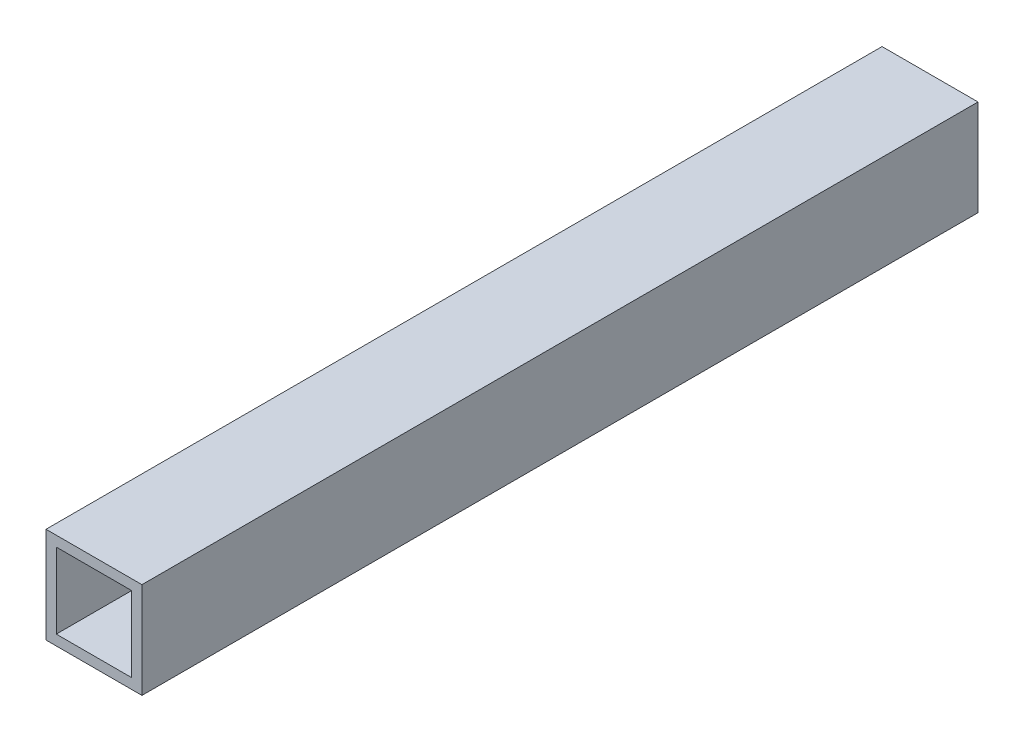
ISO-10303-21;
HEADER;
FILE_DESCRIPTION(('STEP AP214'),'2;1');
FILE_NAME('part.step','',(''),(''),'','','');
FILE_SCHEMA(('AUTOMOTIVE_DESIGN { 1 0 10303 214 1 1 1 1 }'));
ENDSEC;
DATA;
#1=APPLICATION_CONTEXT('core data for automotive mechanical design processes');
#2=APPLICATION_PROTOCOL_DEFINITION('international standard','automotive_design',2000,#1);
#3=PRODUCT_CONTEXT('',#1,'mechanical');
#4=PRODUCT('Part','Part','',(#3));
#5=PRODUCT_RELATED_PRODUCT_CATEGORY('part','',(#4));
#6=PRODUCT_DEFINITION_FORMATION('','',#4);
#7=PRODUCT_DEFINITION_CONTEXT('part definition',#1,'design');
#8=PRODUCT_DEFINITION('design','',#6,#7);
#9=PRODUCT_DEFINITION_SHAPE('','',#8);
#10=(LENGTH_UNIT() NAMED_UNIT(*) SI_UNIT(.MILLI.,.METRE.));
#11=(NAMED_UNIT(*) PLANE_ANGLE_UNIT() SI_UNIT($,.RADIAN.));
#12=(NAMED_UNIT(*) SI_UNIT($,.STERADIAN.) SOLID_ANGLE_UNIT());
#13=UNCERTAINTY_MEASURE_WITH_UNIT(LENGTH_MEASURE(1.E-05),#10,'distance_accuracy_value','');
#14=(GEOMETRIC_REPRESENTATION_CONTEXT(3) GLOBAL_UNCERTAINTY_ASSIGNED_CONTEXT((#13)) GLOBAL_UNIT_ASSIGNED_CONTEXT((#10,
#11,#12)) REPRESENTATION_CONTEXT('',''));
#15=CARTESIAN_POINT('',(0.,0.,0.));
#16=DIRECTION('',(0.,0.,1.));
#17=DIRECTION('',(1.,0.,0.));
#18=AXIS2_PLACEMENT_3D('',#15,#16,#17);
#19=CARTESIAN_POINT('',(0.,0.,122.));
#20=DIRECTION('',(0.,0.,1.));
#21=DIRECTION('',(1.,0.,0.));
#22=AXIS2_PLACEMENT_3D('',#19,#20,#21);
#23=PLANE('',#22);
#24=DIRECTION('',(0.,1.,0.));
#25=VECTOR('',#24,1.);
#26=CARTESIAN_POINT('',(7.,5.5,122.));
#27=LINE('',#26,#25);
#28=CARTESIAN_POINT('',(7.,-7.,122.));
#29=VERTEX_POINT('',#28);
#30=CARTESIAN_POINT('',(7.,7.,122.));
#31=VERTEX_POINT('',#30);
#32=EDGE_CURVE('E158',#29,#31,#27,.T.);
#33=ORIENTED_EDGE('',*,*,#32,.T.);
#34=DIRECTION('',(-1.,0.,0.));
#35=VECTOR('',#34,1.);
#36=CARTESIAN_POINT('',(-5.5,7.,122.));
#37=LINE('',#36,#35);
#38=CARTESIAN_POINT('',(-7.,7.,122.));
#39=VERTEX_POINT('',#38);
#40=EDGE_CURVE('E161',#31,#39,#37,.T.);
#41=ORIENTED_EDGE('',*,*,#40,.T.);
#42=DIRECTION('',(0.,-1.,0.));
#43=VECTOR('',#42,1.);
#44=CARTESIAN_POINT('',(-7.,5.5,122.));
#45=LINE('',#44,#43);
#46=CARTESIAN_POINT('',(-7.,-7.,122.));
#47=VERTEX_POINT('',#46);
#48=EDGE_CURVE('E164',#39,#47,#45,.T.);
#49=ORIENTED_EDGE('',*,*,#48,.T.);
#50=DIRECTION('',(1.,0.,0.));
#51=VECTOR('',#50,1.);
#52=CARTESIAN_POINT('',(-5.5,-7.,122.));
#53=LINE('',#52,#51);
#54=EDGE_CURVE('E166',#47,#29,#53,.T.);
#55=ORIENTED_EDGE('',*,*,#54,.T.);
#56=EDGE_LOOP('',(#33,#41,#49,#55));
#57=FACE_BOUND('',#56,.T.);
#58=DIRECTION('',(-1.,0.,0.));
#59=VECTOR('',#58,1.);
#60=CARTESIAN_POINT('',(-5.5,5.5,122.));
#61=LINE('',#60,#59);
#62=CARTESIAN_POINT('',(5.5,5.5,122.));
#63=VERTEX_POINT('',#62);
#64=CARTESIAN_POINT('',(-5.5,5.5,122.));
#65=VERTEX_POINT('',#64);
#66=EDGE_CURVE('E130',#63,#65,#61,.T.);
#67=ORIENTED_EDGE('',*,*,#66,.F.);
#68=DIRECTION('',(0.,1.,0.));
#69=VECTOR('',#68,1.);
#70=CARTESIAN_POINT('',(5.5,5.5,122.));
#71=LINE('',#70,#69);
#72=CARTESIAN_POINT('',(5.5,-5.5,122.));
#73=VERTEX_POINT('',#72);
#74=EDGE_CURVE('E122',#73,#63,#71,.T.);
#75=ORIENTED_EDGE('',*,*,#74,.F.);
#76=DIRECTION('',(1.,0.,0.));
#77=VECTOR('',#76,1.);
#78=CARTESIAN_POINT('',(-5.5,-5.5,122.));
#79=LINE('',#78,#77);
#80=CARTESIAN_POINT('',(-5.5,-5.5,122.));
#81=VERTEX_POINT('',#80);
#82=EDGE_CURVE('E144',#81,#73,#79,.T.);
#83=ORIENTED_EDGE('',*,*,#82,.F.);
#84=DIRECTION('',(0.,-1.,0.));
#85=VECTOR('',#84,1.);
#86=CARTESIAN_POINT('',(-5.5,5.5,122.));
#87=LINE('',#86,#85);
#88=EDGE_CURVE('E142',#65,#81,#87,.T.);
#89=ORIENTED_EDGE('',*,*,#88,.F.);
#90=EDGE_LOOP('',(#67,#75,#83,#89));
#91=FACE_BOUND('',#90,.T.);
#92=ADVANCED_FACE('F57',(#57,#91),#23,.T.);
#93=CARTESIAN_POINT('',(0.,0.,0.));
#94=DIRECTION('',(0.,0.,1.));
#95=DIRECTION('',(1.,0.,0.));
#96=AXIS2_PLACEMENT_3D('',#93,#94,#95);
#97=PLANE('',#96);
#98=DIRECTION('',(0.,1.,0.));
#99=VECTOR('',#98,1.);
#100=CARTESIAN_POINT('',(7.,5.5,0.));
#101=LINE('',#100,#99);
#102=CARTESIAN_POINT('',(7.,-7.,0.));
#103=VERTEX_POINT('',#102);
#104=CARTESIAN_POINT('',(7.,7.,0.));
#105=VERTEX_POINT('',#104);
#106=EDGE_CURVE('E138',#103,#105,#101,.T.);
#107=ORIENTED_EDGE('',*,*,#106,.F.);
#108=DIRECTION('',(1.,0.,0.));
#109=VECTOR('',#108,1.);
#110=CARTESIAN_POINT('',(-5.5,-7.,0.));
#111=LINE('',#110,#109);
#112=CARTESIAN_POINT('',(-7.,-7.,0.));
#113=VERTEX_POINT('',#112);
#114=EDGE_CURVE('E162',#113,#103,#111,.T.);
#115=ORIENTED_EDGE('',*,*,#114,.F.);
#116=DIRECTION('',(0.,-1.,0.));
#117=VECTOR('',#116,1.);
#118=CARTESIAN_POINT('',(-7.,5.5,0.));
#119=LINE('',#118,#117);
#120=CARTESIAN_POINT('',(-7.,7.,0.));
#121=VERTEX_POINT('',#120);
#122=EDGE_CURVE('E173',#121,#113,#119,.T.);
#123=ORIENTED_EDGE('',*,*,#122,.F.);
#124=DIRECTION('',(-1.,0.,0.));
#125=VECTOR('',#124,1.);
#126=CARTESIAN_POINT('',(-5.5,7.,0.));
#127=LINE('',#126,#125);
#128=EDGE_CURVE('E171',#105,#121,#127,.T.);
#129=ORIENTED_EDGE('',*,*,#128,.F.);
#130=EDGE_LOOP('',(#107,#115,#123,#129));
#131=FACE_BOUND('',#130,.T.);
#132=DIRECTION('',(0.,1.,0.));
#133=VECTOR('',#132,1.);
#134=CARTESIAN_POINT('',(5.5,5.5,0.));
#135=LINE('',#134,#133);
#136=CARTESIAN_POINT('',(5.5,-5.5,0.));
#137=VERTEX_POINT('',#136);
#138=CARTESIAN_POINT('',(5.5,5.5,0.));
#139=VERTEX_POINT('',#138);
#140=EDGE_CURVE('E80',#137,#139,#135,.T.);
#141=ORIENTED_EDGE('',*,*,#140,.T.);
#142=DIRECTION('',(-1.,0.,0.));
#143=VECTOR('',#142,1.);
#144=CARTESIAN_POINT('',(-5.5,5.5,0.));
#145=LINE('',#144,#143);
#146=CARTESIAN_POINT('',(-5.5,5.5,0.));
#147=VERTEX_POINT('',#146);
#148=EDGE_CURVE('E137',#139,#147,#145,.T.);
#149=ORIENTED_EDGE('',*,*,#148,.T.);
#150=DIRECTION('',(0.,-1.,0.));
#151=VECTOR('',#150,1.);
#152=CARTESIAN_POINT('',(-5.5,5.5,0.));
#153=LINE('',#152,#151);
#154=CARTESIAN_POINT('',(-5.5,-5.5,0.));
#155=VERTEX_POINT('',#154);
#156=EDGE_CURVE('E150',#147,#155,#153,.T.);
#157=ORIENTED_EDGE('',*,*,#156,.T.);
#158=DIRECTION('',(1.,0.,0.));
#159=VECTOR('',#158,1.);
#160=CARTESIAN_POINT('',(-5.5,-5.5,0.));
#161=LINE('',#160,#159);
#162=EDGE_CURVE('E131',#155,#137,#161,.T.);
#163=ORIENTED_EDGE('',*,*,#162,.T.);
#164=EDGE_LOOP('',(#141,#149,#157,#163));
#165=FACE_BOUND('',#164,.T.);
#166=ADVANCED_FACE('F191',(#131,#165),#97,.F.);
#167=CARTESIAN_POINT('',(7.,5.5,122.));
#168=DIRECTION('',(-1.,0.,0.));
#169=DIRECTION('',(0.,-1.,0.));
#170=AXIS2_PLACEMENT_3D('',#167,#168,#169);
#171=PLANE('',#170);
#172=ORIENTED_EDGE('',*,*,#106,.T.);
#173=DIRECTION('',(0.,0.,-1.));
#174=VECTOR('',#173,1.);
#175=CARTESIAN_POINT('',(7.,7.,122.));
#176=LINE('',#175,#174);
#177=EDGE_CURVE('E12',#31,#105,#176,.T.);
#178=ORIENTED_EDGE('',*,*,#177,.F.);
#179=ORIENTED_EDGE('',*,*,#32,.F.);
#180=DIRECTION('',(0.,0.,-1.));
#181=VECTOR('',#180,1.);
#182=CARTESIAN_POINT('',(7.,-7.,122.));
#183=LINE('',#182,#181);
#184=EDGE_CURVE('E168',#29,#103,#183,.T.);
#185=ORIENTED_EDGE('',*,*,#184,.T.);
#186=EDGE_LOOP('',(#172,#178,#179,#185));
#187=FACE_BOUND('',#186,.T.);
#188=ADVANCED_FACE('F59',(#187),#171,.F.);
#189=CARTESIAN_POINT('',(-5.5,7.,122.));
#190=DIRECTION('',(0.,-1.,0.));
#191=DIRECTION('',(0.,0.,-1.));
#192=AXIS2_PLACEMENT_3D('',#189,#190,#191);
#193=PLANE('',#192);
#194=ORIENTED_EDGE('',*,*,#128,.T.);
#195=DIRECTION('',(0.,0.,-1.));
#196=VECTOR('',#195,1.);
#197=CARTESIAN_POINT('',(-7.,7.,122.));
#198=LINE('',#197,#196);
#199=EDGE_CURVE('E65',#39,#121,#198,.T.);
#200=ORIENTED_EDGE('',*,*,#199,.F.);
#201=ORIENTED_EDGE('',*,*,#40,.F.);
#202=ORIENTED_EDGE('',*,*,#177,.T.);
#203=EDGE_LOOP('',(#194,#200,#201,#202));
#204=FACE_BOUND('',#203,.T.);
#205=ADVANCED_FACE('F201',(#204),#193,.F.);
#206=CARTESIAN_POINT('',(-7.,5.5,122.));
#207=DIRECTION('',(1.,0.,0.));
#208=DIRECTION('',(0.,1.,0.));
#209=AXIS2_PLACEMENT_3D('',#206,#207,#208);
#210=PLANE('',#209);
#211=ORIENTED_EDGE('',*,*,#122,.T.);
#212=DIRECTION('',(0.,0.,-1.));
#213=VECTOR('',#212,1.);
#214=CARTESIAN_POINT('',(-7.,-7.,122.));
#215=LINE('',#214,#213);
#216=EDGE_CURVE('E178',#47,#113,#215,.T.);
#217=ORIENTED_EDGE('',*,*,#216,.F.);
#218=ORIENTED_EDGE('',*,*,#48,.F.);
#219=ORIENTED_EDGE('',*,*,#199,.T.);
#220=EDGE_LOOP('',(#211,#217,#218,#219));
#221=FACE_BOUND('',#220,.T.);
#222=ADVANCED_FACE('F185',(#221),#210,.F.);
#223=CARTESIAN_POINT('',(-5.5,-7.,122.));
#224=DIRECTION('',(0.,1.,0.));
#225=DIRECTION('',(0.,0.,1.));
#226=AXIS2_PLACEMENT_3D('',#223,#224,#225);
#227=PLANE('',#226);
#228=ORIENTED_EDGE('',*,*,#114,.T.);
#229=ORIENTED_EDGE('',*,*,#184,.F.);
#230=ORIENTED_EDGE('',*,*,#54,.F.);
#231=ORIENTED_EDGE('',*,*,#216,.T.);
#232=EDGE_LOOP('',(#228,#229,#230,#231));
#233=FACE_BOUND('',#232,.T.);
#234=ADVANCED_FACE('F195',(#233),#227,.F.);
#235=CARTESIAN_POINT('',(5.5,5.5,122.));
#236=DIRECTION('',(-1.,0.,0.));
#237=DIRECTION('',(0.,-1.,0.));
#238=AXIS2_PLACEMENT_3D('',#235,#236,#237);
#239=PLANE('',#238);
#240=ORIENTED_EDGE('',*,*,#140,.F.);
#241=DIRECTION('',(0.,0.,-1.));
#242=VECTOR('',#241,1.);
#243=CARTESIAN_POINT('',(5.5,-5.5,122.));
#244=LINE('',#243,#242);
#245=EDGE_CURVE('E126',#73,#137,#244,.T.);
#246=ORIENTED_EDGE('',*,*,#245,.F.);
#247=ORIENTED_EDGE('',*,*,#74,.T.);
#248=DIRECTION('',(0.,0.,-1.));
#249=VECTOR('',#248,1.);
#250=CARTESIAN_POINT('',(5.5,5.5,122.));
#251=LINE('',#250,#249);
#252=EDGE_CURVE('E125',#63,#139,#251,.T.);
#253=ORIENTED_EDGE('',*,*,#252,.T.);
#254=EDGE_LOOP('',(#240,#246,#247,#253));
#255=FACE_BOUND('',#254,.T.);
#256=ADVANCED_FACE('F124',(#255),#239,.T.);
#257=CARTESIAN_POINT('',(-5.5,5.5,122.));
#258=DIRECTION('',(0.,-1.,0.));
#259=DIRECTION('',(0.,0.,-1.));
#260=AXIS2_PLACEMENT_3D('',#257,#258,#259);
#261=PLANE('',#260);
#262=ORIENTED_EDGE('',*,*,#148,.F.);
#263=ORIENTED_EDGE('',*,*,#252,.F.);
#264=ORIENTED_EDGE('',*,*,#66,.T.);
#265=DIRECTION('',(0.,0.,-1.));
#266=VECTOR('',#265,1.);
#267=CARTESIAN_POINT('',(-5.5,5.5,122.));
#268=LINE('',#267,#266);
#269=EDGE_CURVE('E139',#65,#147,#268,.T.);
#270=ORIENTED_EDGE('',*,*,#269,.T.);
#271=EDGE_LOOP('',(#262,#263,#264,#270));
#272=FACE_BOUND('',#271,.T.);
#273=ADVANCED_FACE('F134',(#272),#261,.T.);
#274=CARTESIAN_POINT('',(-5.5,5.5,122.));
#275=DIRECTION('',(1.,0.,0.));
#276=DIRECTION('',(0.,1.,0.));
#277=AXIS2_PLACEMENT_3D('',#274,#275,#276);
#278=PLANE('',#277);
#279=ORIENTED_EDGE('',*,*,#156,.F.);
#280=ORIENTED_EDGE('',*,*,#269,.F.);
#281=ORIENTED_EDGE('',*,*,#88,.T.);
#282=DIRECTION('',(0.,0.,-1.));
#283=VECTOR('',#282,1.);
#284=CARTESIAN_POINT('',(-5.5,-5.5,122.));
#285=LINE('',#284,#283);
#286=EDGE_CURVE('E72',#81,#155,#285,.T.);
#287=ORIENTED_EDGE('',*,*,#286,.T.);
#288=EDGE_LOOP('',(#279,#280,#281,#287));
#289=FACE_BOUND('',#288,.T.);
#290=ADVANCED_FACE('F224',(#289),#278,.T.);
#291=CARTESIAN_POINT('',(-5.5,-5.5,122.));
#292=DIRECTION('',(0.,1.,0.));
#293=DIRECTION('',(0.,0.,1.));
#294=AXIS2_PLACEMENT_3D('',#291,#292,#293);
#295=PLANE('',#294);
#296=ORIENTED_EDGE('',*,*,#162,.F.);
#297=ORIENTED_EDGE('',*,*,#286,.F.);
#298=ORIENTED_EDGE('',*,*,#82,.T.);
#299=ORIENTED_EDGE('',*,*,#245,.T.);
#300=EDGE_LOOP('',(#296,#297,#298,#299));
#301=FACE_BOUND('',#300,.T.);
#302=ADVANCED_FACE('F228',(#301),#295,.T.);
#303=CLOSED_SHELL('',(#92,#166,#188,#205,#222,#234,#256,#273,#290,#302));
#304=MANIFOLD_SOLID_BREP('B2',#303);
#305=ADVANCED_BREP_SHAPE_REPRESENTATION('',(#18,#304),#14);
#306=SHAPE_DEFINITION_REPRESENTATION(#9,#305);
ENDSEC;
END-ISO-10303-21;
